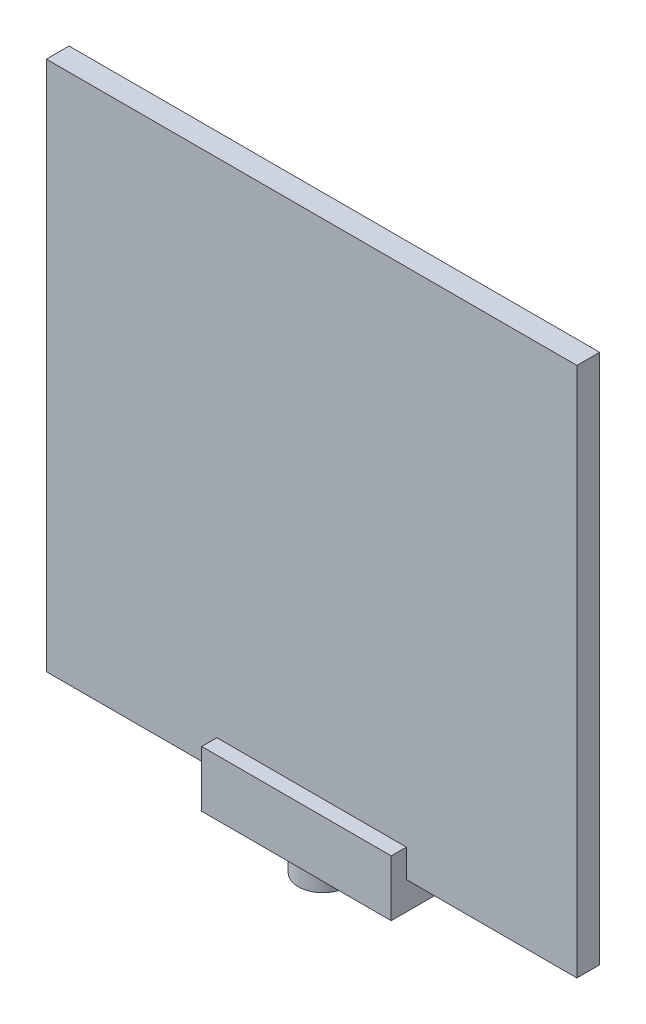
ISO-10303-21;
HEADER;
FILE_DESCRIPTION(('STEP AP214'),'2;1');
FILE_NAME('part.step','',(''),(''),'','','');
FILE_SCHEMA(('AUTOMOTIVE_DESIGN { 1 0 10303 214 1 1 1 1 }'));
ENDSEC;
DATA;
#1=APPLICATION_CONTEXT('core data for automotive mechanical design processes');
#2=APPLICATION_PROTOCOL_DEFINITION('international standard','automotive_design',2000,#1);
#3=PRODUCT_CONTEXT('',#1,'mechanical');
#4=PRODUCT('Part','Part','',(#3));
#5=PRODUCT_RELATED_PRODUCT_CATEGORY('part','',(#4));
#6=PRODUCT_DEFINITION_FORMATION('','',#4);
#7=PRODUCT_DEFINITION_CONTEXT('part definition',#1,'design');
#8=PRODUCT_DEFINITION('design','',#6,#7);
#9=PRODUCT_DEFINITION_SHAPE('','',#8);
#10=(LENGTH_UNIT() NAMED_UNIT(*) SI_UNIT(.MILLI.,.METRE.));
#11=(NAMED_UNIT(*) PLANE_ANGLE_UNIT() SI_UNIT($,.RADIAN.));
#12=(NAMED_UNIT(*) SI_UNIT($,.STERADIAN.) SOLID_ANGLE_UNIT());
#13=UNCERTAINTY_MEASURE_WITH_UNIT(LENGTH_MEASURE(1.E-05),#10,'distance_accuracy_value','');
#14=(GEOMETRIC_REPRESENTATION_CONTEXT(3) GLOBAL_UNCERTAINTY_ASSIGNED_CONTEXT((#13)) GLOBAL_UNIT_ASSIGNED_CONTEXT((#10,
#11,#12)) REPRESENTATION_CONTEXT('',''));
#15=CARTESIAN_POINT('',(0.,0.,0.));
#16=DIRECTION('',(0.,0.,1.));
#17=DIRECTION('',(1.,0.,0.));
#18=AXIS2_PLACEMENT_3D('',#15,#16,#17);
#19=CARTESIAN_POINT('',(-35.,-35.,3.));
#20=DIRECTION('',(0.,1.,0.));
#21=DIRECTION('',(0.,0.,1.));
#22=AXIS2_PLACEMENT_3D('',#19,#20,#21);
#23=PLANE('',#22);
#24=DIRECTION('',(1.,0.,0.));
#25=VECTOR('',#24,1.);
#26=CARTESIAN_POINT('',(-35.,-35.,0.));
#27=LINE('',#26,#25);
#28=CARTESIAN_POINT('',(-35.,-35.,0.));
#29=VERTEX_POINT('',#28);
#30=CARTESIAN_POINT('',(-12.5,-35.,0.));
#31=VERTEX_POINT('',#30);
#32=EDGE_CURVE('E245',#29,#31,#27,.T.);
#33=ORIENTED_EDGE('',*,*,#32,.T.);
#34=DIRECTION('',(0.,0.,1.));
#35=VECTOR('',#34,1.);
#36=CARTESIAN_POINT('',(-12.5,-35.,3.));
#37=LINE('',#36,#35);
#38=CARTESIAN_POINT('',(-12.5,-35.,3.));
#39=VERTEX_POINT('',#38);
#40=EDGE_CURVE('E214',#31,#39,#37,.T.);
#41=ORIENTED_EDGE('',*,*,#40,.T.);
#42=DIRECTION('',(1.,0.,0.));
#43=VECTOR('',#42,1.);
#44=CARTESIAN_POINT('',(-35.,-35.,3.));
#45=LINE('',#44,#43);
#46=CARTESIAN_POINT('',(-35.,-35.,3.));
#47=VERTEX_POINT('',#46);
#48=EDGE_CURVE('E229',#47,#39,#45,.T.);
#49=ORIENTED_EDGE('',*,*,#48,.F.);
#50=DIRECTION('',(0.,0.,-1.));
#51=VECTOR('',#50,1.);
#52=CARTESIAN_POINT('',(-35.,-35.,3.));
#53=LINE('',#52,#51);
#54=EDGE_CURVE('E255',#47,#29,#53,.T.);
#55=ORIENTED_EDGE('',*,*,#54,.T.);
#56=EDGE_LOOP('',(#33,#41,#49,#55));
#57=FACE_BOUND('',#56,.T.);
#58=ADVANCED_FACE('F43',(#57),#23,.F.);
#59=CARTESIAN_POINT('',(-35.,35.,3.));
#60=DIRECTION('',(0.,1.,0.));
#61=DIRECTION('',(0.,0.,1.));
#62=AXIS2_PLACEMENT_3D('',#59,#60,#61);
#63=PLANE('',#62);
#64=DIRECTION('',(1.,0.,0.));
#65=VECTOR('',#64,1.);
#66=CARTESIAN_POINT('',(-35.,35.,0.));
#67=LINE('',#66,#65);
#68=CARTESIAN_POINT('',(-35.,35.,0.));
#69=VERTEX_POINT('',#68);
#70=CARTESIAN_POINT('',(35.,35.,0.));
#71=VERTEX_POINT('',#70);
#72=EDGE_CURVE('E221',#69,#71,#67,.T.);
#73=ORIENTED_EDGE('',*,*,#72,.F.);
#74=DIRECTION('',(0.,0.,-1.));
#75=VECTOR('',#74,1.);
#76=CARTESIAN_POINT('',(-35.,35.,3.));
#77=LINE('',#76,#75);
#78=CARTESIAN_POINT('',(-35.,35.,3.));
#79=VERTEX_POINT('',#78);
#80=EDGE_CURVE('E69',#79,#69,#77,.T.);
#81=ORIENTED_EDGE('',*,*,#80,.F.);
#82=DIRECTION('',(1.,0.,0.));
#83=VECTOR('',#82,1.);
#84=CARTESIAN_POINT('',(-35.,35.,3.));
#85=LINE('',#84,#83);
#86=CARTESIAN_POINT('',(35.,35.,3.));
#87=VERTEX_POINT('',#86);
#88=EDGE_CURVE('E222',#79,#87,#85,.T.);
#89=ORIENTED_EDGE('',*,*,#88,.T.);
#90=DIRECTION('',(0.,0.,-1.));
#91=VECTOR('',#90,1.);
#92=CARTESIAN_POINT('',(35.,35.,3.));
#93=LINE('',#92,#91);
#94=EDGE_CURVE('E236',#87,#71,#93,.T.);
#95=ORIENTED_EDGE('',*,*,#94,.T.);
#96=EDGE_LOOP('',(#73,#81,#89,#95));
#97=FACE_BOUND('',#96,.T.);
#98=ADVANCED_FACE('F45',(#97),#63,.T.);
#99=CARTESIAN_POINT('',(-35.,-35.,3.));
#100=DIRECTION('',(-1.,0.,0.));
#101=DIRECTION('',(0.,0.,1.));
#102=AXIS2_PLACEMENT_3D('',#99,#100,#101);
#103=PLANE('',#102);
#104=DIRECTION('',(0.,1.,0.));
#105=VECTOR('',#104,1.);
#106=CARTESIAN_POINT('',(-35.,-35.,0.));
#107=LINE('',#106,#105);
#108=EDGE_CURVE('E225',#29,#69,#107,.T.);
#109=ORIENTED_EDGE('',*,*,#108,.F.);
#110=ORIENTED_EDGE('',*,*,#54,.F.);
#111=DIRECTION('',(0.,1.,0.));
#112=VECTOR('',#111,1.);
#113=CARTESIAN_POINT('',(-35.,-35.,3.));
#114=LINE('',#113,#112);
#115=EDGE_CURVE('E233',#47,#79,#114,.T.);
#116=ORIENTED_EDGE('',*,*,#115,.T.);
#117=ORIENTED_EDGE('',*,*,#80,.T.);
#118=EDGE_LOOP('',(#109,#110,#116,#117));
#119=FACE_BOUND('',#118,.T.);
#120=ADVANCED_FACE('F276',(#119),#103,.T.);
#121=CARTESIAN_POINT('',(12.5,-35.,3.));
#122=VERTEX_POINT('',#121);
#123=CARTESIAN_POINT('',(35.,-35.,3.));
#124=VERTEX_POINT('',#123);
#125=EDGE_CURVE('E228',#122,#124,#45,.T.);
#126=ORIENTED_EDGE('',*,*,#125,.F.);
#127=DIRECTION('',(0.,0.,-1.));
#128=VECTOR('',#127,1.);
#129=CARTESIAN_POINT('',(12.5,-35.,3.));
#130=LINE('',#129,#128);
#131=CARTESIAN_POINT('',(12.5,-35.,0.));
#132=VERTEX_POINT('',#131);
#133=EDGE_CURVE('E207',#122,#132,#130,.T.);
#134=ORIENTED_EDGE('',*,*,#133,.T.);
#135=CARTESIAN_POINT('',(35.,-35.,0.));
#136=VERTEX_POINT('',#135);
#137=EDGE_CURVE('E244',#132,#136,#27,.T.);
#138=ORIENTED_EDGE('',*,*,#137,.T.);
#139=DIRECTION('',(0.,0.,-1.));
#140=VECTOR('',#139,1.);
#141=CARTESIAN_POINT('',(35.,-35.,3.));
#142=LINE('',#141,#140);
#143=EDGE_CURVE('E258',#124,#136,#142,.T.);
#144=ORIENTED_EDGE('',*,*,#143,.F.);
#145=EDGE_LOOP('',(#126,#134,#138,#144));
#146=FACE_BOUND('',#145,.T.);
#147=ADVANCED_FACE('F283',(#146),#23,.F.);
#148=CARTESIAN_POINT('',(35.,-35.,3.));
#149=DIRECTION('',(-1.,0.,0.));
#150=DIRECTION('',(0.,0.,1.));
#151=AXIS2_PLACEMENT_3D('',#148,#149,#150);
#152=PLANE('',#151);
#153=DIRECTION('',(0.,1.,0.));
#154=VECTOR('',#153,1.);
#155=CARTESIAN_POINT('',(35.,-35.,0.));
#156=LINE('',#155,#154);
#157=EDGE_CURVE('E240',#136,#71,#156,.T.);
#158=ORIENTED_EDGE('',*,*,#157,.T.);
#159=ORIENTED_EDGE('',*,*,#94,.F.);
#160=DIRECTION('',(0.,1.,0.));
#161=VECTOR('',#160,1.);
#162=CARTESIAN_POINT('',(35.,-35.,3.));
#163=LINE('',#162,#161);
#164=EDGE_CURVE('E95',#124,#87,#163,.T.);
#165=ORIENTED_EDGE('',*,*,#164,.F.);
#166=ORIENTED_EDGE('',*,*,#143,.T.);
#167=EDGE_LOOP('',(#158,#159,#165,#166));
#168=FACE_BOUND('',#167,.T.);
#169=ADVANCED_FACE('F279',(#168),#152,.F.);
#170=CARTESIAN_POINT('',(0.,0.,3.));
#171=DIRECTION('',(0.,0.,1.));
#172=DIRECTION('',(1.,0.,0.));
#173=AXIS2_PLACEMENT_3D('',#170,#171,#172);
#174=PLANE('',#173);
#175=DIRECTION('',(0.,-1.,0.));
#176=VECTOR('',#175,1.);
#177=CARTESIAN_POINT('',(-12.5,0.,3.));
#178=LINE('',#177,#176);
#179=CARTESIAN_POINT('',(-12.5,-31.293577559996,3.));
#180=VERTEX_POINT('',#179);
#181=EDGE_CURVE('E218',#180,#39,#178,.T.);
#182=ORIENTED_EDGE('',*,*,#181,.F.);
#183=DIRECTION('',(-1.,0.,0.));
#184=VECTOR('',#183,1.);
#185=CARTESIAN_POINT('',(0.,-31.293577559996,3.));
#186=LINE('',#185,#184);
#187=CARTESIAN_POINT('',(12.5,-31.293577559996,3.));
#188=VERTEX_POINT('',#187);
#189=EDGE_CURVE('E196',#188,#180,#186,.T.);
#190=ORIENTED_EDGE('',*,*,#189,.F.);
#191=DIRECTION('',(0.,1.,0.));
#192=VECTOR('',#191,1.);
#193=CARTESIAN_POINT('',(12.5,0.,3.));
#194=LINE('',#193,#192);
#195=EDGE_CURVE('E211',#122,#188,#194,.T.);
#196=ORIENTED_EDGE('',*,*,#195,.F.);
#197=ORIENTED_EDGE('',*,*,#125,.T.);
#198=ORIENTED_EDGE('',*,*,#164,.T.);
#199=ORIENTED_EDGE('',*,*,#88,.F.);
#200=ORIENTED_EDGE('',*,*,#115,.F.);
#201=ORIENTED_EDGE('',*,*,#48,.T.);
#202=EDGE_LOOP('',(#182,#190,#196,#197,#198,#199,#200,#201));
#203=FACE_BOUND('',#202,.T.);
#204=ADVANCED_FACE('F289',(#203),#174,.T.);
#205=CARTESIAN_POINT('',(0.,0.,0.));
#206=DIRECTION('',(0.,0.,1.));
#207=DIRECTION('',(1.,0.,0.));
#208=AXIS2_PLACEMENT_3D('',#205,#206,#207);
#209=PLANE('',#208);
#210=DIRECTION('',(-1.,0.,0.));
#211=VECTOR('',#210,1.);
#212=CARTESIAN_POINT('',(0.,-31.293577559996,0.));
#213=LINE('',#212,#211);
#214=CARTESIAN_POINT('',(12.5,-31.293577559996,0.));
#215=VERTEX_POINT('',#214);
#216=CARTESIAN_POINT('',(-12.5,-31.293577559996,0.));
#217=VERTEX_POINT('',#216);
#218=EDGE_CURVE('E254',#215,#217,#213,.T.);
#219=ORIENTED_EDGE('',*,*,#218,.T.);
#220=DIRECTION('',(0.,-1.,0.));
#221=VECTOR('',#220,1.);
#222=CARTESIAN_POINT('',(-12.5,0.,0.));
#223=LINE('',#222,#221);
#224=EDGE_CURVE('E47',#217,#31,#223,.T.);
#225=ORIENTED_EDGE('',*,*,#224,.T.);
#226=ORIENTED_EDGE('',*,*,#32,.F.);
#227=ORIENTED_EDGE('',*,*,#108,.T.);
#228=ORIENTED_EDGE('',*,*,#72,.T.);
#229=ORIENTED_EDGE('',*,*,#157,.F.);
#230=ORIENTED_EDGE('',*,*,#137,.F.);
#231=DIRECTION('',(0.,1.,0.));
#232=VECTOR('',#231,1.);
#233=CARTESIAN_POINT('',(12.5,0.,0.));
#234=LINE('',#233,#232);
#235=EDGE_CURVE('E265',#132,#215,#234,.T.);
#236=ORIENTED_EDGE('',*,*,#235,.T.);
#237=EDGE_LOOP('',(#219,#225,#226,#227,#228,#229,#230,#236));
#238=FACE_BOUND('',#237,.T.);
#239=ADVANCED_FACE('F272',(#238),#209,.F.);
#240=CARTESIAN_POINT('',(12.5,-31.293577559996,5.));
#241=DIRECTION('',(0.,1.,0.));
#242=DIRECTION('',(0.,0.,1.));
#243=AXIS2_PLACEMENT_3D('',#240,#241,#242);
#244=PLANE('',#243);
#245=ORIENTED_EDGE('',*,*,#218,.F.);
#246=DIRECTION('',(0.,0.,-1.));
#247=VECTOR('',#246,1.);
#248=CARTESIAN_POINT('',(12.5,-31.293577559996,5.));
#249=LINE('',#248,#247);
#250=CARTESIAN_POINT('',(12.5,-31.293577559996,-2.));
#251=VERTEX_POINT('',#250);
#252=EDGE_CURVE('E155',#215,#251,#249,.T.);
#253=ORIENTED_EDGE('',*,*,#252,.T.);
#254=DIRECTION('',(1.,0.,0.));
#255=VECTOR('',#254,1.);
#256=CARTESIAN_POINT('',(12.5,-31.293577559996,-2.));
#257=LINE('',#256,#255);
#258=CARTESIAN_POINT('',(-12.5,-31.293577559996,-2.));
#259=VERTEX_POINT('',#258);
#260=EDGE_CURVE('E152',#259,#251,#257,.T.);
#261=ORIENTED_EDGE('',*,*,#260,.F.);
#262=DIRECTION('',(0.,0.,-1.));
#263=VECTOR('',#262,1.);
#264=CARTESIAN_POINT('',(-12.5,-31.293577559996,5.));
#265=LINE('',#264,#263);
#266=EDGE_CURVE('E60',#217,#259,#265,.T.);
#267=ORIENTED_EDGE('',*,*,#266,.F.);
#268=EDGE_LOOP('',(#245,#253,#261,#267));
#269=FACE_BOUND('',#268,.T.);
#270=ADVANCED_FACE('F153',(#269),#244,.T.);
#271=CARTESIAN_POINT('',(-12.5,-38.706422440004,5.));
#272=DIRECTION('',(-1.,0.,0.));
#273=DIRECTION('',(0.,0.,1.));
#274=AXIS2_PLACEMENT_3D('',#271,#272,#273);
#275=PLANE('',#274);
#276=CARTESIAN_POINT('',(-12.5,-31.293577559996,5.));
#277=VERTEX_POINT('',#276);
#278=EDGE_CURVE('E148',#277,#180,#265,.T.);
#279=ORIENTED_EDGE('',*,*,#278,.T.);
#280=ORIENTED_EDGE('',*,*,#181,.T.);
#281=ORIENTED_EDGE('',*,*,#40,.F.);
#282=ORIENTED_EDGE('',*,*,#224,.F.);
#283=ORIENTED_EDGE('',*,*,#266,.T.);
#284=DIRECTION('',(0.,1.,0.));
#285=VECTOR('',#284,1.);
#286=CARTESIAN_POINT('',(-12.5,-38.706422440004,-2.));
#287=LINE('',#286,#285);
#288=CARTESIAN_POINT('',(-12.5,-38.706422440004,-2.));
#289=VERTEX_POINT('',#288);
#290=EDGE_CURVE('E144',#289,#259,#287,.T.);
#291=ORIENTED_EDGE('',*,*,#290,.F.);
#292=DIRECTION('',(0.,0.,-1.));
#293=VECTOR('',#292,1.);
#294=CARTESIAN_POINT('',(-12.5,-38.706422440004,5.));
#295=LINE('',#294,#293);
#296=CARTESIAN_POINT('',(-12.5,-38.706422440004,5.));
#297=VERTEX_POINT('',#296);
#298=EDGE_CURVE('E193',#297,#289,#295,.T.);
#299=ORIENTED_EDGE('',*,*,#298,.F.);
#300=DIRECTION('',(0.,1.,0.));
#301=VECTOR('',#300,1.);
#302=CARTESIAN_POINT('',(-12.5,-38.706422440004,5.));
#303=LINE('',#302,#301);
#304=EDGE_CURVE('E178',#297,#277,#303,.T.);
#305=ORIENTED_EDGE('',*,*,#304,.T.);
#306=EDGE_LOOP('',(#279,#280,#281,#282,#283,#291,#299,#305));
#307=FACE_BOUND('',#306,.T.);
#308=ADVANCED_FACE('F142',(#307),#275,.T.);
#309=CARTESIAN_POINT('',(12.5,-38.706422440004,5.));
#310=DIRECTION('',(0.,-1.,0.));
#311=DIRECTION('',(0.,0.,-1.));
#312=AXIS2_PLACEMENT_3D('',#309,#310,#311);
#313=PLANE('',#312);
#314=CARTESIAN_POINT('',(0.,-38.706422440004,1.5));
#315=DIRECTION('',(0.,-1.,0.));
#316=DIRECTION('',(0.,0.,-1.));
#317=AXIS2_PLACEMENT_3D('',#314,#315,#316);
#318=CIRCLE('',#317,3.25);
#319=CARTESIAN_POINT('',(0.,-38.706422440004,-1.75));
#320=VERTEX_POINT('',#319);
#321=EDGE_CURVE('E11',#320,#320,#318,.T.);
#322=ORIENTED_EDGE('',*,*,#321,.F.);
#323=EDGE_LOOP('',(#322));
#324=FACE_BOUND('',#323,.T.);
#325=ORIENTED_EDGE('',*,*,#298,.T.);
#326=DIRECTION('',(-1.,0.,0.));
#327=VECTOR('',#326,1.);
#328=CARTESIAN_POINT('',(12.5,-38.706422440004,-2.));
#329=LINE('',#328,#327);
#330=CARTESIAN_POINT('',(12.5,-38.706422440004,-2.));
#331=VERTEX_POINT('',#330);
#332=EDGE_CURVE('E165',#331,#289,#329,.T.);
#333=ORIENTED_EDGE('',*,*,#332,.F.);
#334=DIRECTION('',(0.,0.,-1.));
#335=VECTOR('',#334,1.);
#336=CARTESIAN_POINT('',(12.5,-38.706422440004,5.));
#337=LINE('',#336,#335);
#338=CARTESIAN_POINT('',(12.5,-38.706422440004,5.));
#339=VERTEX_POINT('',#338);
#340=EDGE_CURVE('E197',#339,#331,#337,.T.);
#341=ORIENTED_EDGE('',*,*,#340,.F.);
#342=DIRECTION('',(-1.,0.,0.));
#343=VECTOR('',#342,1.);
#344=CARTESIAN_POINT('',(12.5,-38.706422440004,5.));
#345=LINE('',#344,#343);
#346=EDGE_CURVE('E149',#339,#297,#345,.T.);
#347=ORIENTED_EDGE('',*,*,#346,.T.);
#348=EDGE_LOOP('',(#325,#333,#341,#347));
#349=FACE_BOUND('',#348,.T.);
#350=ADVANCED_FACE('F302',(#324,#349),#313,.T.);
#351=CARTESIAN_POINT('',(12.5,-38.706422440004,5.));
#352=DIRECTION('',(1.,0.,0.));
#353=DIRECTION('',(0.,0.,-1.));
#354=AXIS2_PLACEMENT_3D('',#351,#352,#353);
#355=PLANE('',#354);
#356=ORIENTED_EDGE('',*,*,#133,.F.);
#357=ORIENTED_EDGE('',*,*,#195,.T.);
#358=CARTESIAN_POINT('',(12.5,-31.293577559996,5.));
#359=VERTEX_POINT('',#358);
#360=EDGE_CURVE('E200',#359,#188,#249,.T.);
#361=ORIENTED_EDGE('',*,*,#360,.F.);
#362=DIRECTION('',(0.,-1.,0.));
#363=VECTOR('',#362,1.);
#364=CARTESIAN_POINT('',(12.5,-38.706422440004,5.));
#365=LINE('',#364,#363);
#366=EDGE_CURVE('E186',#359,#339,#365,.T.);
#367=ORIENTED_EDGE('',*,*,#366,.T.);
#368=ORIENTED_EDGE('',*,*,#340,.T.);
#369=DIRECTION('',(0.,-1.,0.));
#370=VECTOR('',#369,1.);
#371=CARTESIAN_POINT('',(12.5,-38.706422440004,-2.));
#372=LINE('',#371,#370);
#373=EDGE_CURVE('E160',#251,#331,#372,.T.);
#374=ORIENTED_EDGE('',*,*,#373,.F.);
#375=ORIENTED_EDGE('',*,*,#252,.F.);
#376=ORIENTED_EDGE('',*,*,#235,.F.);
#377=EDGE_LOOP('',(#356,#357,#361,#367,#368,#374,#375,#376));
#378=FACE_BOUND('',#377,.T.);
#379=ADVANCED_FACE('F292',(#378),#355,.T.);
#380=ORIENTED_EDGE('',*,*,#360,.T.);
#381=ORIENTED_EDGE('',*,*,#189,.T.);
#382=ORIENTED_EDGE('',*,*,#278,.F.);
#383=DIRECTION('',(1.,0.,0.));
#384=VECTOR('',#383,1.);
#385=CARTESIAN_POINT('',(12.5,-31.293577559996,5.));
#386=LINE('',#385,#384);
#387=EDGE_CURVE('E182',#277,#359,#386,.T.);
#388=ORIENTED_EDGE('',*,*,#387,.T.);
#389=EDGE_LOOP('',(#380,#381,#382,#388));
#390=FACE_BOUND('',#389,.T.);
#391=ADVANCED_FACE('F295',(#390),#244,.T.);
#392=CARTESIAN_POINT('',(0.,0.,5.));
#393=DIRECTION('',(0.,0.,1.));
#394=DIRECTION('',(1.,0.,0.));
#395=AXIS2_PLACEMENT_3D('',#392,#393,#394);
#396=PLANE('',#395);
#397=ORIENTED_EDGE('',*,*,#304,.F.);
#398=ORIENTED_EDGE('',*,*,#346,.F.);
#399=ORIENTED_EDGE('',*,*,#366,.F.);
#400=ORIENTED_EDGE('',*,*,#387,.F.);
#401=EDGE_LOOP('',(#397,#398,#399,#400));
#402=FACE_BOUND('',#401,.T.);
#403=ADVANCED_FACE('F299',(#402),#396,.T.);
#404=CARTESIAN_POINT('',(0.,0.,-2.));
#405=DIRECTION('',(0.,0.,1.));
#406=DIRECTION('',(1.,0.,0.));
#407=AXIS2_PLACEMENT_3D('',#404,#405,#406);
#408=PLANE('',#407);
#409=ORIENTED_EDGE('',*,*,#290,.T.);
#410=ORIENTED_EDGE('',*,*,#260,.T.);
#411=ORIENTED_EDGE('',*,*,#373,.T.);
#412=ORIENTED_EDGE('',*,*,#332,.T.);
#413=EDGE_LOOP('',(#409,#410,#411,#412));
#414=FACE_BOUND('',#413,.T.);
#415=ADVANCED_FACE('F163',(#414),#408,.F.);
#416=CARTESIAN_POINT('',(0.,-41.206422440004,1.5));
#417=DIRECTION('',(0.,-1.,0.));
#418=DIRECTION('',(0.,0.,-1.));
#419=AXIS2_PLACEMENT_3D('',#416,#417,#418);
#420=PLANE('',#419);
#421=CARTESIAN_POINT('',(0.,-41.206422440004,1.5));
#422=DIRECTION('',(0.,-1.,0.));
#423=DIRECTION('',(0.,0.,-1.));
#424=AXIS2_PLACEMENT_3D('',#421,#422,#423);
#425=CIRCLE('',#424,3.25);
#426=CARTESIAN_POINT('',(0.,-41.206422440004,-1.75));
#427=VERTEX_POINT('',#426);
#428=EDGE_CURVE('E171',#427,#427,#425,.T.);
#429=ORIENTED_EDGE('',*,*,#428,.T.);
#430=EDGE_LOOP('',(#429));
#431=FACE_BOUND('',#430,.T.);
#432=CARTESIAN_POINT('',(0.,-41.206422440004,1.5));
#433=DIRECTION('',(0.,-1.,0.));
#434=DIRECTION('',(0.,0.,-1.));
#435=AXIS2_PLACEMENT_3D('',#432,#433,#434);
#436=CIRCLE('',#435,2.24999999999747);
#437=CARTESIAN_POINT('',(0.,-41.206422440004,-0.749999999997474));
#438=VERTEX_POINT('',#437);
#439=EDGE_CURVE('E496',#438,#438,#436,.T.);
#440=ORIENTED_EDGE('',*,*,#439,.F.);
#441=EDGE_LOOP('',(#440));
#442=FACE_BOUND('',#441,.T.);
#443=ADVANCED_FACE('F375',(#431,#442),#420,.T.);
#444=CARTESIAN_POINT('',(0.,-41.206422440004,1.5));
#445=DIRECTION('',(0.,1.,0.));
#446=DIRECTION('',(0.,0.,1.));
#447=AXIS2_PLACEMENT_3D('',#444,#445,#446);
#448=CYLINDRICAL_SURFACE('',#447,3.25);
#449=ORIENTED_EDGE('',*,*,#428,.F.);
#450=EDGE_LOOP('',(#449));
#451=FACE_BOUND('',#450,.T.);
#452=ORIENTED_EDGE('',*,*,#321,.T.);
#453=EDGE_LOOP('',(#452));
#454=FACE_BOUND('',#453,.T.);
#455=ADVANCED_FACE('F388',(#451,#454),#448,.T.);
#456=CARTESIAN_POINT('',(0.,-36.206422440004,1.49999999999648));
#457=DIRECTION('',(0.,-1.,0.));
#458=DIRECTION('',(0.,0.,-1.));
#459=AXIS2_PLACEMENT_3D('',#456,#457,#458);
#460=PLANE('',#459);
#461=CARTESIAN_POINT('',(0.,-36.206422440004,1.49999999999648));
#462=DIRECTION('',(0.,-1.,0.));
#463=DIRECTION('',(0.,0.,-1.));
#464=AXIS2_PLACEMENT_3D('',#461,#462,#463);
#465=CIRCLE('',#464,2.25);
#466=CARTESIAN_POINT('',(0.,-36.206422440004,-0.750000000003524));
#467=VERTEX_POINT('',#466);
#468=EDGE_CURVE('E167',#467,#467,#465,.T.);
#469=ORIENTED_EDGE('',*,*,#468,.T.);
#470=EDGE_LOOP('',(#469));
#471=FACE_BOUND('',#470,.T.);
#472=ADVANCED_FACE('F383',(#471),#460,.T.);
#473=CARTESIAN_POINT('',(0.,-36.206422440004,1.49999999999648));
#474=DIRECTION('',(0.,-1.,0.));
#475=DIRECTION('',(0.,0.,-1.));
#476=AXIS2_PLACEMENT_3D('',#473,#474,#475);
#477=CYLINDRICAL_SURFACE('',#476,2.25);
#478=ORIENTED_EDGE('',*,*,#468,.F.);
#479=EDGE_LOOP('',(#478));
#480=FACE_BOUND('',#479,.T.);
#481=ORIENTED_EDGE('',*,*,#439,.T.);
#482=EDGE_LOOP('',(#481));
#483=FACE_BOUND('',#482,.T.);
#484=ADVANCED_FACE('F387',(#480,#483),#477,.F.);
#485=CLOSED_SHELL('',(#58,#98,#120,#147,#169,#204,#239,#270,#308,#350,#379,#391,#403,#415,#443,
#455,#472,#484));
#486=MANIFOLD_SOLID_BREP('B2',#485);
#487=ADVANCED_BREP_SHAPE_REPRESENTATION('',(#18,#486),#14);
#488=SHAPE_DEFINITION_REPRESENTATION(#9,#487);
ENDSEC;
END-ISO-10303-21;
